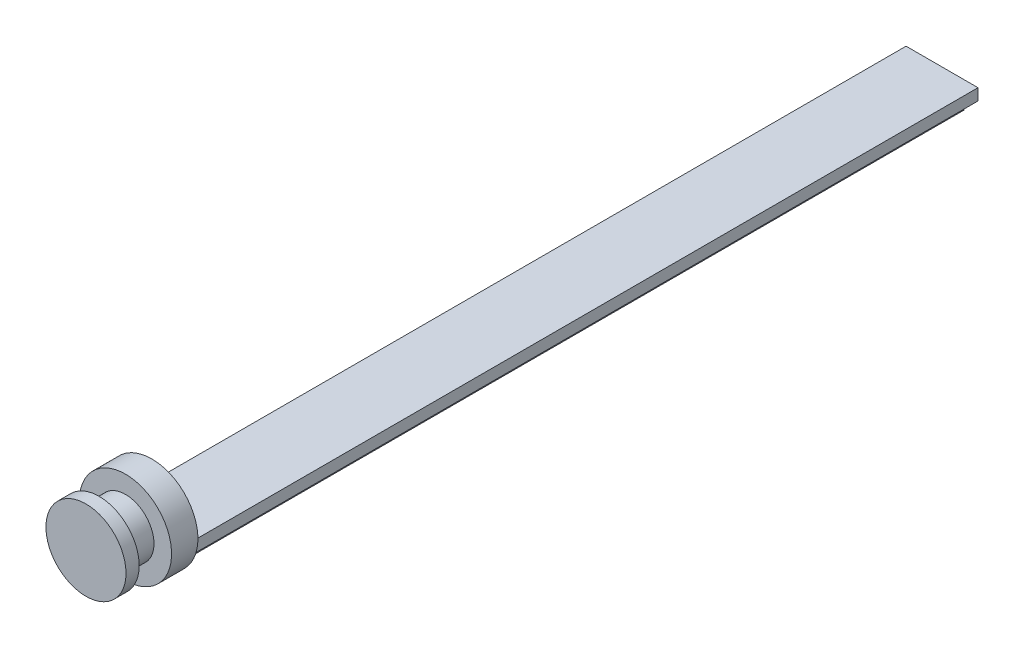
ISO-10303-21;
HEADER;
FILE_DESCRIPTION(('STEP AP214'),'2;1');
FILE_NAME('part.step','',(''),(''),'','','');
FILE_SCHEMA(('AUTOMOTIVE_DESIGN { 1 0 10303 214 1 1 1 1 }'));
ENDSEC;
DATA;
#1=APPLICATION_CONTEXT('core data for automotive mechanical design processes');
#2=APPLICATION_PROTOCOL_DEFINITION('international standard','automotive_design',2000,#1);
#3=PRODUCT_CONTEXT('',#1,'mechanical');
#4=PRODUCT('Part','Part','',(#3));
#5=PRODUCT_RELATED_PRODUCT_CATEGORY('part','',(#4));
#6=PRODUCT_DEFINITION_FORMATION('','',#4);
#7=PRODUCT_DEFINITION_CONTEXT('part definition',#1,'design');
#8=PRODUCT_DEFINITION('design','',#6,#7);
#9=PRODUCT_DEFINITION_SHAPE('','',#8);
#10=(LENGTH_UNIT() NAMED_UNIT(*) SI_UNIT(.MILLI.,.METRE.));
#11=(NAMED_UNIT(*) PLANE_ANGLE_UNIT() SI_UNIT($,.RADIAN.));
#12=(NAMED_UNIT(*) SI_UNIT($,.STERADIAN.) SOLID_ANGLE_UNIT());
#13=UNCERTAINTY_MEASURE_WITH_UNIT(LENGTH_MEASURE(1.E-05),#10,'distance_accuracy_value','');
#14=(GEOMETRIC_REPRESENTATION_CONTEXT(3) GLOBAL_UNCERTAINTY_ASSIGNED_CONTEXT((#13)) GLOBAL_UNIT_ASSIGNED_CONTEXT((#10,
#11,#12)) REPRESENTATION_CONTEXT('',''));
#15=CARTESIAN_POINT('',(0.,0.,0.));
#16=DIRECTION('',(0.,0.,1.));
#17=DIRECTION('',(1.,0.,0.));
#18=AXIS2_PLACEMENT_3D('',#15,#16,#17);
#19=CARTESIAN_POINT('',(0.,0.,1.5));
#20=DIRECTION('',(0.,0.,-1.));
#21=DIRECTION('',(-1.,0.,0.));
#22=AXIS2_PLACEMENT_3D('',#19,#20,#21);
#23=CYLINDRICAL_SURFACE('',#22,4.56);
#24=CARTESIAN_POINT('',(0.,0.,1.5));
#25=DIRECTION('',(0.,0.,1.));
#26=DIRECTION('',(1.,0.,0.));
#27=AXIS2_PLACEMENT_3D('',#24,#25,#26);
#28=CIRCLE('',#27,4.56);
#29=CARTESIAN_POINT('',(4.56,0.,1.5));
#30=VERTEX_POINT('',#29);
#31=EDGE_CURVE('E43',#30,#30,#28,.T.);
#32=ORIENTED_EDGE('',*,*,#31,.F.);
#33=EDGE_LOOP('',(#32));
#34=FACE_BOUND('',#33,.T.);
#35=CARTESIAN_POINT('',(0.,0.,0.));
#36=DIRECTION('',(0.,0.,1.));
#37=DIRECTION('',(1.,0.,0.));
#38=AXIS2_PLACEMENT_3D('',#35,#36,#37);
#39=CIRCLE('',#38,4.56);
#40=CARTESIAN_POINT('',(4.56,0.,0.));
#41=VERTEX_POINT('',#40);
#42=EDGE_CURVE('E38',#41,#41,#39,.T.);
#43=ORIENTED_EDGE('',*,*,#42,.T.);
#44=EDGE_LOOP('',(#43));
#45=FACE_BOUND('',#44,.T.);
#46=ADVANCED_FACE('F35',(#34,#45),#23,.T.);
#47=CARTESIAN_POINT('',(0.,0.,1.5));
#48=DIRECTION('',(0.,0.,1.));
#49=DIRECTION('',(1.,0.,0.));
#50=AXIS2_PLACEMENT_3D('',#47,#48,#49);
#51=PLANE('',#50);
#52=ORIENTED_EDGE('',*,*,#31,.T.);
#53=EDGE_LOOP('',(#52));
#54=FACE_BOUND('',#53,.T.);
#55=ADVANCED_FACE('F188',(#54),#51,.T.);
#56=CARTESIAN_POINT('',(0.,0.,0.));
#57=DIRECTION('',(0.,0.,1.));
#58=DIRECTION('',(1.,0.,0.));
#59=AXIS2_PLACEMENT_3D('',#56,#57,#58);
#60=PLANE('',#59);
#61=CARTESIAN_POINT('',(0.,0.,0.));
#62=DIRECTION('',(0.,0.,-1.));
#63=DIRECTION('',(-1.,0.,0.));
#64=AXIS2_PLACEMENT_3D('',#61,#62,#63);
#65=CIRCLE('',#64,3.25);
#66=CARTESIAN_POINT('',(-3.25,0.,0.));
#67=VERTEX_POINT('',#66);
#68=EDGE_CURVE('E11',#67,#67,#65,.T.);
#69=ORIENTED_EDGE('',*,*,#68,.F.);
#70=EDGE_LOOP('',(#69));
#71=FACE_BOUND('',#70,.T.);
#72=ORIENTED_EDGE('',*,*,#42,.F.);
#73=EDGE_LOOP('',(#72));
#74=FACE_BOUND('',#73,.T.);
#75=ADVANCED_FACE('F185',(#71,#74),#60,.F.);
#76=CARTESIAN_POINT('',(0.,0.,-3.));
#77=DIRECTION('',(0.,0.,1.));
#78=DIRECTION('',(1.,0.,0.));
#79=AXIS2_PLACEMENT_3D('',#76,#77,#78);
#80=CYLINDRICAL_SURFACE('',#79,3.25);
#81=CARTESIAN_POINT('',(0.,0.,-3.));
#82=DIRECTION('',(0.,0.,-1.));
#83=DIRECTION('',(-1.,0.,0.));
#84=AXIS2_PLACEMENT_3D('',#81,#82,#83);
#85=CIRCLE('',#84,3.25);
#86=CARTESIAN_POINT('',(-3.25,0.,-3.));
#87=VERTEX_POINT('',#86);
#88=EDGE_CURVE('E174',#87,#87,#85,.T.);
#89=ORIENTED_EDGE('',*,*,#88,.F.);
#90=EDGE_LOOP('',(#89));
#91=FACE_BOUND('',#90,.T.);
#92=ORIENTED_EDGE('',*,*,#68,.T.);
#93=EDGE_LOOP('',(#92));
#94=FACE_BOUND('',#93,.T.);
#95=ADVANCED_FACE('F187',(#91,#94),#80,.T.);
#96=CARTESIAN_POINT('',(0.,0.,-6.));
#97=DIRECTION('',(0.,0.,1.));
#98=DIRECTION('',(1.,0.,0.));
#99=AXIS2_PLACEMENT_3D('',#96,#97,#98);
#100=CYLINDRICAL_SURFACE('',#99,5.25);
#101=CARTESIAN_POINT('',(0.,0.,-6.));
#102=DIRECTION('',(0.,0.,-1.));
#103=DIRECTION('',(-1.,0.,0.));
#104=AXIS2_PLACEMENT_3D('',#101,#102,#103);
#105=CIRCLE('',#104,5.25);
#106=CARTESIAN_POINT('',(-5.25,0.,-6.));
#107=VERTEX_POINT('',#106);
#108=EDGE_CURVE('E171',#107,#107,#105,.T.);
#109=ORIENTED_EDGE('',*,*,#108,.F.);
#110=EDGE_LOOP('',(#109));
#111=FACE_BOUND('',#110,.T.);
#112=CARTESIAN_POINT('',(0.,0.,-3.));
#113=DIRECTION('',(0.,0.,-1.));
#114=DIRECTION('',(-1.,0.,0.));
#115=AXIS2_PLACEMENT_3D('',#112,#113,#114);
#116=CIRCLE('',#115,5.25);
#117=CARTESIAN_POINT('',(-5.25,0.,-3.));
#118=VERTEX_POINT('',#117);
#119=EDGE_CURVE('E109',#118,#118,#116,.T.);
#120=ORIENTED_EDGE('',*,*,#119,.T.);
#121=EDGE_LOOP('',(#120));
#122=FACE_BOUND('',#121,.T.);
#123=ADVANCED_FACE('F194',(#111,#122),#100,.T.);
#124=CARTESIAN_POINT('',(0.,0.,-6.));
#125=DIRECTION('',(0.,0.,-1.));
#126=DIRECTION('',(-1.,0.,0.));
#127=AXIS2_PLACEMENT_3D('',#124,#125,#126);
#128=PLANE('',#127);
#129=DIRECTION('',(1.,0.,0.));
#130=VECTOR('',#129,1.);
#131=CARTESIAN_POINT('',(0.,-4.10218253302047,-6.));
#132=LINE('',#131,#130);
#133=CARTESIAN_POINT('',(-2.5,-4.10218253302047,-6.));
#134=VERTEX_POINT('',#133);
#135=CARTESIAN_POINT('',(2.5,-4.10218253302047,-6.));
#136=VERTEX_POINT('',#135);
#137=EDGE_CURVE('E106',#134,#136,#132,.T.);
#138=ORIENTED_EDGE('',*,*,#137,.T.);
#139=DIRECTION('',(0.,1.,0.));
#140=VECTOR('',#139,1.);
#141=CARTESIAN_POINT('',(2.5,0.,-6.));
#142=LINE('',#141,#140);
#143=CARTESIAN_POINT('',(2.5,-2.40164141024107,-6.));
#144=VERTEX_POINT('',#143);
#145=EDGE_CURVE('E121',#136,#144,#142,.T.);
#146=ORIENTED_EDGE('',*,*,#145,.T.);
#147=DIRECTION('',(1.,0.,0.));
#148=VECTOR('',#147,1.);
#149=CARTESIAN_POINT('',(0.,-2.40164141024107,-6.));
#150=LINE('',#149,#148);
#151=CARTESIAN_POINT('',(4.09612193102978,-2.40164141024107,-6.));
#152=VERTEX_POINT('',#151);
#153=EDGE_CURVE('E151',#144,#152,#150,.T.);
#154=ORIENTED_EDGE('',*,*,#153,.T.);
#155=DIRECTION('',(0.,1.,0.));
#156=VECTOR('',#155,1.);
#157=CARTESIAN_POINT('',(4.09612193102978,0.,-6.));
#158=LINE('',#157,#156);
#159=CARTESIAN_POINT('',(4.09612193102978,-1.08894299967451,-6.));
#160=VERTEX_POINT('',#159);
#161=EDGE_CURVE('E149',#152,#160,#158,.T.);
#162=ORIENTED_EDGE('',*,*,#161,.T.);
#163=DIRECTION('',(-1.,0.,0.));
#164=VECTOR('',#163,1.);
#165=CARTESIAN_POINT('',(0.,-1.08894299967451,-6.));
#166=LINE('',#165,#164);
#167=CARTESIAN_POINT('',(-4.09612193102979,-1.08894299967451,-6.));
#168=VERTEX_POINT('',#167);
#169=EDGE_CURVE('E147',#160,#168,#166,.T.);
#170=ORIENTED_EDGE('',*,*,#169,.T.);
#171=DIRECTION('',(0.,-1.,0.));
#172=VECTOR('',#171,1.);
#173=CARTESIAN_POINT('',(-4.09612193102979,0.,-6.));
#174=LINE('',#173,#172);
#175=CARTESIAN_POINT('',(-4.09612193102979,-2.40164141024107,-6.));
#176=VERTEX_POINT('',#175);
#177=EDGE_CURVE('E145',#168,#176,#174,.T.);
#178=ORIENTED_EDGE('',*,*,#177,.T.);
#179=DIRECTION('',(1.,0.,0.));
#180=VECTOR('',#179,1.);
#181=CARTESIAN_POINT('',(0.,-2.40164141024107,-6.));
#182=LINE('',#181,#180);
#183=CARTESIAN_POINT('',(-2.5,-2.40164141024107,-6.));
#184=VERTEX_POINT('',#183);
#185=EDGE_CURVE('E56',#176,#184,#182,.T.);
#186=ORIENTED_EDGE('',*,*,#185,.T.);
#187=DIRECTION('',(0.,-1.,0.));
#188=VECTOR('',#187,1.);
#189=CARTESIAN_POINT('',(-2.5,0.,-6.));
#190=LINE('',#189,#188);
#191=EDGE_CURVE('E51',#184,#134,#190,.T.);
#192=ORIENTED_EDGE('',*,*,#191,.T.);
#193=EDGE_LOOP('',(#138,#146,#154,#162,#170,#178,#186,#192));
#194=FACE_BOUND('',#193,.T.);
#195=ORIENTED_EDGE('',*,*,#108,.T.);
#196=EDGE_LOOP('',(#195));
#197=FACE_BOUND('',#196,.T.);
#198=ADVANCED_FACE('F226',(#194,#197),#128,.T.);
#199=CARTESIAN_POINT('',(0.,0.,-3.));
#200=DIRECTION('',(0.,0.,-1.));
#201=DIRECTION('',(-1.,0.,0.));
#202=AXIS2_PLACEMENT_3D('',#199,#200,#201);
#203=PLANE('',#202);
#204=ORIENTED_EDGE('',*,*,#88,.T.);
#205=EDGE_LOOP('',(#204));
#206=FACE_BOUND('',#205,.T.);
#207=ORIENTED_EDGE('',*,*,#119,.F.);
#208=EDGE_LOOP('',(#207));
#209=FACE_BOUND('',#208,.T.);
#210=ADVANCED_FACE('F234',(#206,#209),#203,.F.);
#211=CARTESIAN_POINT('',(0.,-4.10218253302047,-96.));
#212=DIRECTION('',(0.,-1.,0.));
#213=DIRECTION('',(1.,0.,0.));
#214=AXIS2_PLACEMENT_3D('',#211,#212,#213);
#215=PLANE('',#214);
#216=ORIENTED_EDGE('',*,*,#137,.F.);
#217=DIRECTION('',(0.,0.,1.));
#218=VECTOR('',#217,1.);
#219=CARTESIAN_POINT('',(-2.5,-4.10218253302047,-96.));
#220=LINE('',#219,#218);
#221=CARTESIAN_POINT('',(-2.5,-4.10218253302047,-96.));
#222=VERTEX_POINT('',#221);
#223=EDGE_CURVE('E100',#222,#134,#220,.T.);
#224=ORIENTED_EDGE('',*,*,#223,.F.);
#225=DIRECTION('',(1.,0.,0.));
#226=VECTOR('',#225,1.);
#227=CARTESIAN_POINT('',(0.,-4.10218253302047,-96.));
#228=LINE('',#227,#226);
#229=CARTESIAN_POINT('',(2.5,-4.10218253302047,-96.));
#230=VERTEX_POINT('',#229);
#231=EDGE_CURVE('E104',#222,#230,#228,.T.);
#232=ORIENTED_EDGE('',*,*,#231,.T.);
#233=DIRECTION('',(0.,0.,1.));
#234=VECTOR('',#233,1.);
#235=CARTESIAN_POINT('',(2.5,-4.10218253302047,-96.));
#236=LINE('',#235,#234);
#237=EDGE_CURVE('E141',#230,#136,#236,.T.);
#238=ORIENTED_EDGE('',*,*,#237,.T.);
#239=EDGE_LOOP('',(#216,#224,#232,#238));
#240=FACE_BOUND('',#239,.T.);
#241=ADVANCED_FACE('F102',(#240),#215,.T.);
#242=CARTESIAN_POINT('',(-2.5,0.,-96.));
#243=DIRECTION('',(-1.,0.,0.));
#244=DIRECTION('',(0.,-1.,0.));
#245=AXIS2_PLACEMENT_3D('',#242,#243,#244);
#246=PLANE('',#245);
#247=ORIENTED_EDGE('',*,*,#191,.F.);
#248=DIRECTION('',(0.,0.,1.));
#249=VECTOR('',#248,1.);
#250=CARTESIAN_POINT('',(-2.5,-2.40164141024107,-96.));
#251=LINE('',#250,#249);
#252=CARTESIAN_POINT('',(-2.5,-2.40164141024107,-96.));
#253=VERTEX_POINT('',#252);
#254=EDGE_CURVE('E110',#253,#184,#251,.T.);
#255=ORIENTED_EDGE('',*,*,#254,.F.);
#256=DIRECTION('',(0.,-1.,0.));
#257=VECTOR('',#256,1.);
#258=CARTESIAN_POINT('',(-2.5,0.,-96.));
#259=LINE('',#258,#257);
#260=EDGE_CURVE('E116',#253,#222,#259,.T.);
#261=ORIENTED_EDGE('',*,*,#260,.T.);
#262=ORIENTED_EDGE('',*,*,#223,.T.);
#263=EDGE_LOOP('',(#247,#255,#261,#262));
#264=FACE_BOUND('',#263,.T.);
#265=ADVANCED_FACE('F123',(#264),#246,.T.);
#266=CARTESIAN_POINT('',(0.,-2.40164141024107,-96.));
#267=DIRECTION('',(0.,-1.,0.));
#268=DIRECTION('',(1.,0.,0.));
#269=AXIS2_PLACEMENT_3D('',#266,#267,#268);
#270=PLANE('',#269);
#271=ORIENTED_EDGE('',*,*,#185,.F.);
#272=DIRECTION('',(0.,0.,1.));
#273=VECTOR('',#272,1.);
#274=CARTESIAN_POINT('',(-4.09612193102979,-2.40164141024107,-96.));
#275=LINE('',#274,#273);
#276=CARTESIAN_POINT('',(-4.09612193102979,-2.40164141024107,-96.));
#277=VERTEX_POINT('',#276);
#278=EDGE_CURVE('E167',#277,#176,#275,.T.);
#279=ORIENTED_EDGE('',*,*,#278,.F.);
#280=DIRECTION('',(1.,0.,0.));
#281=VECTOR('',#280,1.);
#282=CARTESIAN_POINT('',(0.,-2.40164141024107,-96.));
#283=LINE('',#282,#281);
#284=EDGE_CURVE('E124',#277,#253,#283,.T.);
#285=ORIENTED_EDGE('',*,*,#284,.T.);
#286=ORIENTED_EDGE('',*,*,#254,.T.);
#287=EDGE_LOOP('',(#271,#279,#285,#286));
#288=FACE_BOUND('',#287,.T.);
#289=ADVANCED_FACE('F262',(#288),#270,.T.);
#290=CARTESIAN_POINT('',(-4.09612193102979,0.,-96.));
#291=DIRECTION('',(-1.,0.,0.));
#292=DIRECTION('',(0.,0.,1.));
#293=AXIS2_PLACEMENT_3D('',#290,#291,#292);
#294=PLANE('',#293);
#295=ORIENTED_EDGE('',*,*,#177,.F.);
#296=DIRECTION('',(0.,0.,1.));
#297=VECTOR('',#296,1.);
#298=CARTESIAN_POINT('',(-4.09612193102979,-1.08894299967451,-96.));
#299=LINE('',#298,#297);
#300=CARTESIAN_POINT('',(-4.09612193102979,-1.08894299967451,-96.));
#301=VERTEX_POINT('',#300);
#302=EDGE_CURVE('E164',#301,#168,#299,.T.);
#303=ORIENTED_EDGE('',*,*,#302,.F.);
#304=DIRECTION('',(0.,-1.,0.));
#305=VECTOR('',#304,1.);
#306=CARTESIAN_POINT('',(-4.09612193102979,0.,-96.));
#307=LINE('',#306,#305);
#308=EDGE_CURVE('E126',#301,#277,#307,.T.);
#309=ORIENTED_EDGE('',*,*,#308,.T.);
#310=ORIENTED_EDGE('',*,*,#278,.T.);
#311=EDGE_LOOP('',(#295,#303,#309,#310));
#312=FACE_BOUND('',#311,.T.);
#313=ADVANCED_FACE('F272',(#312),#294,.T.);
#314=CARTESIAN_POINT('',(0.,-1.08894299967451,-96.));
#315=DIRECTION('',(0.,1.,0.));
#316=DIRECTION('',(-1.,0.,0.));
#317=AXIS2_PLACEMENT_3D('',#314,#315,#316);
#318=PLANE('',#317);
#319=ORIENTED_EDGE('',*,*,#169,.F.);
#320=DIRECTION('',(0.,0.,1.));
#321=VECTOR('',#320,1.);
#322=CARTESIAN_POINT('',(4.09612193102978,-1.08894299967451,-96.));
#323=LINE('',#322,#321);
#324=CARTESIAN_POINT('',(4.09612193102978,-1.08894299967451,-96.));
#325=VERTEX_POINT('',#324);
#326=EDGE_CURVE('E161',#325,#160,#323,.T.);
#327=ORIENTED_EDGE('',*,*,#326,.F.);
#328=DIRECTION('',(-1.,0.,0.));
#329=VECTOR('',#328,1.);
#330=CARTESIAN_POINT('',(0.,-1.08894299967451,-96.));
#331=LINE('',#330,#329);
#332=EDGE_CURVE('E131',#325,#301,#331,.T.);
#333=ORIENTED_EDGE('',*,*,#332,.T.);
#334=ORIENTED_EDGE('',*,*,#302,.T.);
#335=EDGE_LOOP('',(#319,#327,#333,#334));
#336=FACE_BOUND('',#335,.T.);
#337=ADVANCED_FACE('F282',(#336),#318,.T.);
#338=CARTESIAN_POINT('',(4.09612193102978,0.,-96.));
#339=DIRECTION('',(1.,0.,0.));
#340=DIRECTION('',(0.,0.,-1.));
#341=AXIS2_PLACEMENT_3D('',#338,#339,#340);
#342=PLANE('',#341);
#343=ORIENTED_EDGE('',*,*,#161,.F.);
#344=DIRECTION('',(0.,0.,1.));
#345=VECTOR('',#344,1.);
#346=CARTESIAN_POINT('',(4.09612193102978,-2.40164141024107,-96.));
#347=LINE('',#346,#345);
#348=CARTESIAN_POINT('',(4.09612193102978,-2.40164141024107,-96.));
#349=VERTEX_POINT('',#348);
#350=EDGE_CURVE('E158',#349,#152,#347,.T.);
#351=ORIENTED_EDGE('',*,*,#350,.F.);
#352=DIRECTION('',(0.,1.,0.));
#353=VECTOR('',#352,1.);
#354=CARTESIAN_POINT('',(4.09612193102978,0.,-96.));
#355=LINE('',#354,#353);
#356=EDGE_CURVE('E134',#349,#325,#355,.T.);
#357=ORIENTED_EDGE('',*,*,#356,.T.);
#358=ORIENTED_EDGE('',*,*,#326,.T.);
#359=EDGE_LOOP('',(#343,#351,#357,#358));
#360=FACE_BOUND('',#359,.T.);
#361=ADVANCED_FACE('F292',(#360),#342,.T.);
#362=CARTESIAN_POINT('',(0.,-2.40164141024107,-96.));
#363=DIRECTION('',(0.,-1.,0.));
#364=DIRECTION('',(1.,0.,0.));
#365=AXIS2_PLACEMENT_3D('',#362,#363,#364);
#366=PLANE('',#365);
#367=ORIENTED_EDGE('',*,*,#153,.F.);
#368=DIRECTION('',(0.,0.,1.));
#369=VECTOR('',#368,1.);
#370=CARTESIAN_POINT('',(2.5,-2.40164141024107,-96.));
#371=LINE('',#370,#369);
#372=CARTESIAN_POINT('',(2.5,-2.40164141024107,-96.));
#373=VERTEX_POINT('',#372);
#374=EDGE_CURVE('E155',#373,#144,#371,.T.);
#375=ORIENTED_EDGE('',*,*,#374,.F.);
#376=DIRECTION('',(1.,0.,0.));
#377=VECTOR('',#376,1.);
#378=CARTESIAN_POINT('',(0.,-2.40164141024107,-96.));
#379=LINE('',#378,#377);
#380=EDGE_CURVE('E137',#373,#349,#379,.T.);
#381=ORIENTED_EDGE('',*,*,#380,.T.);
#382=ORIENTED_EDGE('',*,*,#350,.T.);
#383=EDGE_LOOP('',(#367,#375,#381,#382));
#384=FACE_BOUND('',#383,.T.);
#385=ADVANCED_FACE('F302',(#384),#366,.T.);
#386=CARTESIAN_POINT('',(2.5,0.,-96.));
#387=DIRECTION('',(1.,0.,0.));
#388=DIRECTION('',(0.,0.,-1.));
#389=AXIS2_PLACEMENT_3D('',#386,#387,#388);
#390=PLANE('',#389);
#391=ORIENTED_EDGE('',*,*,#145,.F.);
#392=ORIENTED_EDGE('',*,*,#237,.F.);
#393=DIRECTION('',(0.,1.,0.));
#394=VECTOR('',#393,1.);
#395=CARTESIAN_POINT('',(2.5,0.,-96.));
#396=LINE('',#395,#394);
#397=EDGE_CURVE('E120',#230,#373,#396,.T.);
#398=ORIENTED_EDGE('',*,*,#397,.T.);
#399=ORIENTED_EDGE('',*,*,#374,.T.);
#400=EDGE_LOOP('',(#391,#392,#398,#399));
#401=FACE_BOUND('',#400,.T.);
#402=ADVANCED_FACE('F313',(#401),#390,.T.);
#403=CARTESIAN_POINT('',(0.,0.,-96.));
#404=DIRECTION('',(0.,0.,-1.));
#405=DIRECTION('',(-1.,0.,0.));
#406=AXIS2_PLACEMENT_3D('',#403,#404,#405);
#407=PLANE('',#406);
#408=ORIENTED_EDGE('',*,*,#231,.F.);
#409=ORIENTED_EDGE('',*,*,#260,.F.);
#410=ORIENTED_EDGE('',*,*,#284,.F.);
#411=ORIENTED_EDGE('',*,*,#308,.F.);
#412=ORIENTED_EDGE('',*,*,#332,.F.);
#413=ORIENTED_EDGE('',*,*,#356,.F.);
#414=ORIENTED_EDGE('',*,*,#380,.F.);
#415=ORIENTED_EDGE('',*,*,#397,.F.);
#416=EDGE_LOOP('',(#408,#409,#410,#411,#412,#413,#414,#415));
#417=FACE_BOUND('',#416,.T.);
#418=ADVANCED_FACE('F114',(#417),#407,.T.);
#419=CLOSED_SHELL('',(#46,#55,#75,#95,#123,#198,#210,#241,#265,#289,#313,#337,#361,#385,#402,#418));
#420=MANIFOLD_SOLID_BREP('B2',#419);
#421=ADVANCED_BREP_SHAPE_REPRESENTATION('',(#18,#420),#14);
#422=SHAPE_DEFINITION_REPRESENTATION(#9,#421);
ENDSEC;
END-ISO-10303-21;
